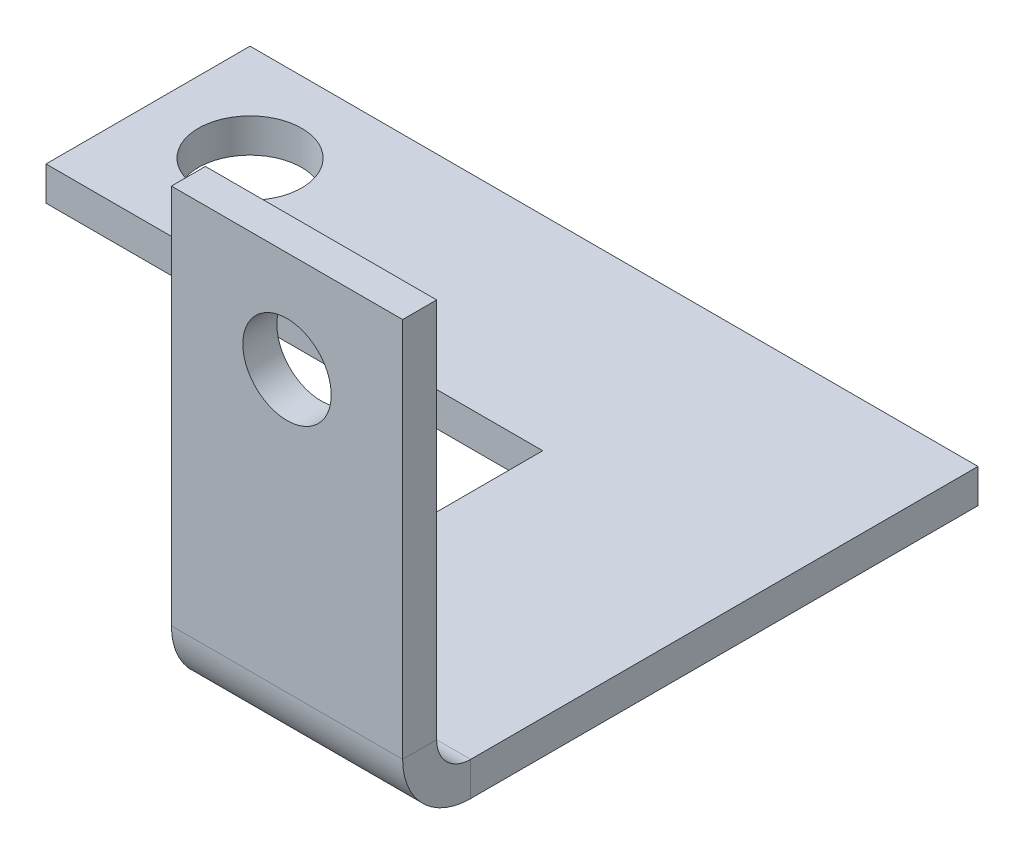
ISO-10303-21;
HEADER;
FILE_DESCRIPTION(('STEP AP214'),'2;1');
FILE_NAME('part.step','',(''),(''),'','','');
FILE_SCHEMA(('AUTOMOTIVE_DESIGN { 1 0 10303 214 1 1 1 1 }'));
ENDSEC;
DATA;
#1=APPLICATION_CONTEXT('core data for automotive mechanical design processes');
#2=APPLICATION_PROTOCOL_DEFINITION('international standard','automotive_design',2000,#1);
#3=PRODUCT_CONTEXT('',#1,'mechanical');
#4=PRODUCT('Part','Part','',(#3));
#5=PRODUCT_RELATED_PRODUCT_CATEGORY('part','',(#4));
#6=PRODUCT_DEFINITION_FORMATION('','',#4);
#7=PRODUCT_DEFINITION_CONTEXT('part definition',#1,'design');
#8=PRODUCT_DEFINITION('design','',#6,#7);
#9=PRODUCT_DEFINITION_SHAPE('','',#8);
#10=(LENGTH_UNIT() NAMED_UNIT(*) SI_UNIT(.MILLI.,.METRE.));
#11=(NAMED_UNIT(*) PLANE_ANGLE_UNIT() SI_UNIT($,.RADIAN.));
#12=(NAMED_UNIT(*) SI_UNIT($,.STERADIAN.) SOLID_ANGLE_UNIT());
#13=UNCERTAINTY_MEASURE_WITH_UNIT(LENGTH_MEASURE(1.E-05),#10,'distance_accuracy_value','');
#14=(GEOMETRIC_REPRESENTATION_CONTEXT(3) GLOBAL_UNCERTAINTY_ASSIGNED_CONTEXT((#13)) GLOBAL_UNIT_ASSIGNED_CONTEXT((#10,
#11,#12)) REPRESENTATION_CONTEXT('',''));
#15=CARTESIAN_POINT('',(0.,0.,0.));
#16=DIRECTION('',(0.,0.,1.));
#17=DIRECTION('',(1.,0.,0.));
#18=AXIS2_PLACEMENT_3D('',#15,#16,#17);
#19=CARTESIAN_POINT('',(0.,0.,3.175));
#20=DIRECTION('',(-1.,0.,0.));
#21=DIRECTION('',(0.,1.,0.));
#22=AXIS2_PLACEMENT_3D('',#19,#20,#21);
#23=PLANE('',#22);
#24=DIRECTION('',(0.,1.,0.));
#25=VECTOR('',#24,1.);
#26=CARTESIAN_POINT('',(0.,0.,0.));
#27=LINE('',#26,#25);
#28=CARTESIAN_POINT('',(0.,6.34999999999999,0.));
#29=VERTEX_POINT('',#28);
#30=CARTESIAN_POINT('',(0.,41.91,0.));
#31=VERTEX_POINT('',#30);
#32=EDGE_CURVE('E254',#29,#31,#27,.T.);
#33=ORIENTED_EDGE('',*,*,#32,.F.);
#34=DIRECTION('',(0.,0.,1.));
#35=VECTOR('',#34,1.);
#36=CARTESIAN_POINT('',(0.,6.34999999999999,0.));
#37=LINE('',#36,#35);
#38=CARTESIAN_POINT('',(0.,6.34999999999999,3.175));
#39=VERTEX_POINT('',#38);
#40=EDGE_CURVE('E226',#29,#39,#37,.T.);
#41=ORIENTED_EDGE('',*,*,#40,.T.);
#42=DIRECTION('',(0.,1.,0.));
#43=VECTOR('',#42,1.);
#44=CARTESIAN_POINT('',(0.,0.,3.175));
#45=LINE('',#44,#43);
#46=CARTESIAN_POINT('',(0.,41.91,3.175));
#47=VERTEX_POINT('',#46);
#48=EDGE_CURVE('E108',#39,#47,#45,.T.);
#49=ORIENTED_EDGE('',*,*,#48,.T.);
#50=DIRECTION('',(0.,0.,1.));
#51=VECTOR('',#50,1.);
#52=CARTESIAN_POINT('',(0.,41.91,3.175));
#53=LINE('',#52,#51);
#54=EDGE_CURVE('E92',#31,#47,#53,.T.);
#55=ORIENTED_EDGE('',*,*,#54,.F.);
#56=EDGE_LOOP('',(#33,#41,#49,#55));
#57=FACE_BOUND('',#56,.T.);
#58=ADVANCED_FACE('F84',(#57),#23,.T.);
#59=CARTESIAN_POINT('',(0.,0.,3.175));
#60=DIRECTION('',(0.,0.,-1.));
#61=DIRECTION('',(-1.,0.,0.));
#62=AXIS2_PLACEMENT_3D('',#59,#60,#61);
#63=PLANE('',#62);
#64=CARTESIAN_POINT('',(10.795,32.4752274840705,3.175));
#65=DIRECTION('',(0.,0.,-1.));
#66=DIRECTION('',(-1.,0.,0.));
#67=AXIS2_PLACEMENT_3D('',#64,#65,#66);
#68=CIRCLE('',#67,4.124999878);
#69=CARTESIAN_POINT('',(6.670000122,32.4752274840705,3.175));
#70=VERTEX_POINT('',#69);
#71=EDGE_CURVE('E242',#70,#70,#68,.T.);
#72=ORIENTED_EDGE('',*,*,#71,.T.);
#73=EDGE_LOOP('',(#72));
#74=FACE_BOUND('',#73,.T.);
#75=DIRECTION('',(-1.,0.,0.));
#76=VECTOR('',#75,1.);
#77=CARTESIAN_POINT('',(0.,6.34999999999999,3.175));
#78=LINE('',#77,#76);
#79=CARTESIAN_POINT('',(21.59,6.34999999999999,3.175));
#80=VERTEX_POINT('',#79);
#81=EDGE_CURVE('E126',#39,#80,#78,.F.);
#82=ORIENTED_EDGE('',*,*,#81,.T.);
#83=DIRECTION('',(0.,1.,0.));
#84=VECTOR('',#83,1.);
#85=CARTESIAN_POINT('',(21.59,0.,3.175));
#86=LINE('',#85,#84);
#87=CARTESIAN_POINT('',(21.59,41.91,3.175));
#88=VERTEX_POINT('',#87);
#89=EDGE_CURVE('E247',#80,#88,#86,.T.);
#90=ORIENTED_EDGE('',*,*,#89,.T.);
#91=DIRECTION('',(1.,0.,0.));
#92=VECTOR('',#91,1.);
#93=CARTESIAN_POINT('',(0.,41.91,3.175));
#94=LINE('',#93,#92);
#95=EDGE_CURVE('E249',#47,#88,#94,.T.);
#96=ORIENTED_EDGE('',*,*,#95,.F.);
#97=ORIENTED_EDGE('',*,*,#48,.F.);
#98=EDGE_LOOP('',(#82,#90,#96,#97));
#99=FACE_BOUND('',#98,.T.);
#100=ADVANCED_FACE('F262',(#74,#99),#63,.F.);
#101=CARTESIAN_POINT('',(0.,0.,0.));
#102=DIRECTION('',(0.,0.,-1.));
#103=DIRECTION('',(-1.,0.,0.));
#104=AXIS2_PLACEMENT_3D('',#101,#102,#103);
#105=PLANE('',#104);
#106=CARTESIAN_POINT('',(10.795,32.4752274840705,0.));
#107=DIRECTION('',(0.,0.,-1.));
#108=DIRECTION('',(-1.,0.,0.));
#109=AXIS2_PLACEMENT_3D('',#106,#107,#108);
#110=CIRCLE('',#109,4.124999878);
#111=CARTESIAN_POINT('',(6.670000122,32.4752274840705,0.));
#112=VERTEX_POINT('',#111);
#113=EDGE_CURVE('E240',#112,#112,#110,.T.);
#114=ORIENTED_EDGE('',*,*,#113,.F.);
#115=EDGE_LOOP('',(#114));
#116=FACE_BOUND('',#115,.T.);
#117=DIRECTION('',(0.,1.,0.));
#118=VECTOR('',#117,1.);
#119=CARTESIAN_POINT('',(21.59,0.,0.));
#120=LINE('',#119,#118);
#121=CARTESIAN_POINT('',(21.59,6.34999999999999,0.));
#122=VERTEX_POINT('',#121);
#123=CARTESIAN_POINT('',(21.59,41.91,0.));
#124=VERTEX_POINT('',#123);
#125=EDGE_CURVE('E120',#122,#124,#120,.T.);
#126=ORIENTED_EDGE('',*,*,#125,.F.);
#127=DIRECTION('',(-1.,0.,0.));
#128=VECTOR('',#127,1.);
#129=CARTESIAN_POINT('',(0.,6.34999999999999,0.));
#130=LINE('',#129,#128);
#131=EDGE_CURVE('E99',#29,#122,#130,.F.);
#132=ORIENTED_EDGE('',*,*,#131,.F.);
#133=ORIENTED_EDGE('',*,*,#32,.T.);
#134=DIRECTION('',(-1.,0.,0.));
#135=VECTOR('',#134,1.);
#136=CARTESIAN_POINT('',(0.,41.91,0.));
#137=LINE('',#136,#135);
#138=EDGE_CURVE('E245',#31,#124,#137,.F.);
#139=ORIENTED_EDGE('',*,*,#138,.T.);
#140=EDGE_LOOP('',(#126,#132,#133,#139));
#141=FACE_BOUND('',#140,.T.);
#142=ADVANCED_FACE('F263',(#116,#141),#105,.T.);
#143=CARTESIAN_POINT('',(21.59,0.,3.175));
#144=DIRECTION('',(-1.,0.,0.));
#145=DIRECTION('',(0.,1.,0.));
#146=AXIS2_PLACEMENT_3D('',#143,#144,#145);
#147=PLANE('',#146);
#148=DIRECTION('',(0.,0.,1.));
#149=VECTOR('',#148,1.);
#150=CARTESIAN_POINT('',(21.59,6.34999999999999,0.));
#151=LINE('',#150,#149);
#152=EDGE_CURVE('E237',#122,#80,#151,.T.);
#153=ORIENTED_EDGE('',*,*,#152,.F.);
#154=ORIENTED_EDGE('',*,*,#125,.T.);
#155=DIRECTION('',(0.,0.,1.));
#156=VECTOR('',#155,1.);
#157=CARTESIAN_POINT('',(21.59,41.91,3.175));
#158=LINE('',#157,#156);
#159=EDGE_CURVE('E13',#124,#88,#158,.T.);
#160=ORIENTED_EDGE('',*,*,#159,.T.);
#161=ORIENTED_EDGE('',*,*,#89,.F.);
#162=EDGE_LOOP('',(#153,#154,#160,#161));
#163=FACE_BOUND('',#162,.T.);
#164=ADVANCED_FACE('F86',(#163),#147,.F.);
#165=CARTESIAN_POINT('',(0.,41.91,3.175));
#166=DIRECTION('',(0.,1.,0.));
#167=DIRECTION('',(1.,0.,0.));
#168=AXIS2_PLACEMENT_3D('',#165,#166,#167);
#169=PLANE('',#168);
#170=ORIENTED_EDGE('',*,*,#159,.F.);
#171=ORIENTED_EDGE('',*,*,#138,.F.);
#172=ORIENTED_EDGE('',*,*,#54,.T.);
#173=ORIENTED_EDGE('',*,*,#95,.T.);
#174=EDGE_LOOP('',(#170,#171,#172,#173));
#175=FACE_BOUND('',#174,.T.);
#176=ADVANCED_FACE('F261',(#175),#169,.T.);
#177=CARTESIAN_POINT('',(10.795,32.4752274840705,3.175));
#178=DIRECTION('',(0.,0.,-1.));
#179=DIRECTION('',(-1.,0.,0.));
#180=AXIS2_PLACEMENT_3D('',#177,#178,#179);
#181=CYLINDRICAL_SURFACE('',#180,4.124999878);
#182=ORIENTED_EDGE('',*,*,#71,.F.);
#183=EDGE_LOOP('',(#182));
#184=FACE_BOUND('',#183,.T.);
#185=ORIENTED_EDGE('',*,*,#113,.T.);
#186=EDGE_LOOP('',(#185));
#187=FACE_BOUND('',#186,.T.);
#188=ADVANCED_FACE('F290',(#184,#187),#181,.F.);
#189=CARTESIAN_POINT('',(21.59,6.34999999999999,-3.175));
#190=DIRECTION('',(1.,0.,0.));
#191=DIRECTION('',(0.,1.,0.));
#192=AXIS2_PLACEMENT_3D('',#189,#190,#191);
#193=PLANE('',#192);
#194=DIRECTION('',(0.,1.,0.));
#195=VECTOR('',#194,1.);
#196=CARTESIAN_POINT('',(21.59,0.,-3.17499999999998));
#197=LINE('',#196,#195);
#198=CARTESIAN_POINT('',(21.59,3.17499999999999,-3.17499999999999));
#199=VERTEX_POINT('',#198);
#200=CARTESIAN_POINT('',(21.59,0.,-3.17499999999998));
#201=VERTEX_POINT('',#200);
#202=EDGE_CURVE('E193',#199,#201,#197,.F.);
#203=ORIENTED_EDGE('',*,*,#202,.F.);
#204=CARTESIAN_POINT('',(21.59,6.34999999999999,-3.175));
#205=DIRECTION('',(-1.,0.,0.));
#206=DIRECTION('',(0.,-1.,0.));
#207=AXIS2_PLACEMENT_3D('',#204,#205,#206);
#208=CIRCLE('',#207,3.175);
#209=EDGE_CURVE('E229',#122,#199,#208,.F.);
#210=ORIENTED_EDGE('',*,*,#209,.F.);
#211=ORIENTED_EDGE('',*,*,#152,.T.);
#212=CARTESIAN_POINT('',(21.59,6.34999999999999,-3.175));
#213=DIRECTION('',(-1.,0.,0.));
#214=DIRECTION('',(0.,-1.,0.));
#215=AXIS2_PLACEMENT_3D('',#212,#213,#214);
#216=CIRCLE('',#215,6.35);
#217=EDGE_CURVE('E222',#80,#201,#216,.F.);
#218=ORIENTED_EDGE('',*,*,#217,.T.);
#219=EDGE_LOOP('',(#203,#210,#211,#218));
#220=FACE_BOUND('',#219,.T.);
#221=ADVANCED_FACE('F288',(#220),#193,.T.);
#222=CARTESIAN_POINT('',(0.,6.34999999999999,-3.175));
#223=DIRECTION('',(1.,0.,0.));
#224=DIRECTION('',(0.,1.,0.));
#225=AXIS2_PLACEMENT_3D('',#222,#223,#224);
#226=PLANE('',#225);
#227=CARTESIAN_POINT('',(0.,6.34999999999999,-3.175));
#228=DIRECTION('',(-1.,0.,0.));
#229=DIRECTION('',(0.,-1.,0.));
#230=AXIS2_PLACEMENT_3D('',#227,#228,#229);
#231=CIRCLE('',#230,3.175);
#232=CARTESIAN_POINT('',(0.,3.17499999999999,-3.17499999999999));
#233=VERTEX_POINT('',#232);
#234=EDGE_CURVE('E233',#233,#29,#231,.T.);
#235=ORIENTED_EDGE('',*,*,#234,.F.);
#236=DIRECTION('',(0.,1.,0.));
#237=VECTOR('',#236,1.);
#238=CARTESIAN_POINT('',(0.,3.17499999999999,-3.17499999999999));
#239=LINE('',#238,#237);
#240=CARTESIAN_POINT('',(0.,0.,-3.17499999999998));
#241=VERTEX_POINT('',#240);
#242=EDGE_CURVE('E214',#233,#241,#239,.F.);
#243=ORIENTED_EDGE('',*,*,#242,.T.);
#244=CARTESIAN_POINT('',(0.,6.34999999999999,-3.175));
#245=DIRECTION('',(-1.,0.,0.));
#246=DIRECTION('',(0.,-1.,0.));
#247=AXIS2_PLACEMENT_3D('',#244,#245,#246);
#248=CIRCLE('',#247,6.35);
#249=EDGE_CURVE('E223',#241,#39,#248,.T.);
#250=ORIENTED_EDGE('',*,*,#249,.T.);
#251=ORIENTED_EDGE('',*,*,#40,.F.);
#252=EDGE_LOOP('',(#235,#243,#250,#251));
#253=FACE_BOUND('',#252,.T.);
#254=ADVANCED_FACE('F267',(#253),#226,.F.);
#255=CARTESIAN_POINT('',(0.,6.34999999999999,-3.175));
#256=DIRECTION('',(-1.,0.,0.));
#257=DIRECTION('',(0.,-1.,0.));
#258=AXIS2_PLACEMENT_3D('',#255,#256,#257);
#259=CYLINDRICAL_SURFACE('',#258,6.35);
#260=ORIENTED_EDGE('',*,*,#81,.F.);
#261=ORIENTED_EDGE('',*,*,#249,.F.);
#262=DIRECTION('',(-1.,0.,0.));
#263=VECTOR('',#262,1.);
#264=CARTESIAN_POINT('',(21.59,0.,-3.17499999999998));
#265=LINE('',#264,#263);
#266=EDGE_CURVE('E212',#241,#201,#265,.F.);
#267=ORIENTED_EDGE('',*,*,#266,.T.);
#268=ORIENTED_EDGE('',*,*,#217,.F.);
#269=EDGE_LOOP('',(#260,#261,#267,#268));
#270=FACE_BOUND('',#269,.T.);
#271=ADVANCED_FACE('F286',(#270),#259,.T.);
#272=CARTESIAN_POINT('',(0.,6.34999999999999,-3.175));
#273=DIRECTION('',(-1.,0.,0.));
#274=DIRECTION('',(0.,-1.,0.));
#275=AXIS2_PLACEMENT_3D('',#272,#273,#274);
#276=CYLINDRICAL_SURFACE('',#275,3.175);
#277=ORIENTED_EDGE('',*,*,#131,.T.);
#278=ORIENTED_EDGE('',*,*,#209,.T.);
#279=DIRECTION('',(-1.,0.,0.));
#280=VECTOR('',#279,1.);
#281=CARTESIAN_POINT('',(21.59,3.17499999999999,-3.17499999999999));
#282=LINE('',#281,#280);
#283=EDGE_CURVE('E217',#199,#233,#282,.T.);
#284=ORIENTED_EDGE('',*,*,#283,.T.);
#285=ORIENTED_EDGE('',*,*,#234,.T.);
#286=EDGE_LOOP('',(#277,#278,#284,#285));
#287=FACE_BOUND('',#286,.T.);
#288=ADVANCED_FACE('F270',(#287),#276,.F.);
#289=CARTESIAN_POINT('',(0.,-1.10154940724527E-13,-31.493260102));
#290=DIRECTION('',(1.,0.,0.));
#291=DIRECTION('',(0.,0.,-1.));
#292=AXIS2_PLACEMENT_3D('',#289,#290,#291);
#293=PLANE('',#292);
#294=ORIENTED_EDGE('',*,*,#242,.F.);
#295=DIRECTION('',(0.,0.,1.));
#296=VECTOR('',#295,1.);
#297=CARTESIAN_POINT('',(0.,3.17499999999989,-31.493260102));
#298=LINE('',#297,#296);
#299=CARTESIAN_POINT('',(0.,3.17499999999989,-31.493260102));
#300=VERTEX_POINT('',#299);
#301=EDGE_CURVE('E210',#233,#300,#298,.F.);
#302=ORIENTED_EDGE('',*,*,#301,.T.);
#303=DIRECTION('',(0.,-1.,0.));
#304=VECTOR('',#303,1.);
#305=CARTESIAN_POINT('',(0.,-1.10154940724527E-13,-31.493260102));
#306=LINE('',#305,#304);
#307=CARTESIAN_POINT('',(0.,-1.09958129945466E-13,-31.493260102));
#308=VERTEX_POINT('',#307);
#309=EDGE_CURVE('E236',#308,#300,#306,.F.);
#310=ORIENTED_EDGE('',*,*,#309,.F.);
#311=DIRECTION('',(0.,0.,-1.));
#312=VECTOR('',#311,1.);
#313=CARTESIAN_POINT('',(0.,0.,0.));
#314=LINE('',#313,#312);
#315=EDGE_CURVE('E200',#241,#308,#314,.T.);
#316=ORIENTED_EDGE('',*,*,#315,.F.);
#317=EDGE_LOOP('',(#294,#302,#310,#316));
#318=FACE_BOUND('',#317,.T.);
#319=ADVANCED_FACE('F281',(#318),#293,.F.);
#320=CARTESIAN_POINT('',(21.59,0.,0.));
#321=DIRECTION('',(-1.,0.,0.));
#322=DIRECTION('',(0.,0.,1.));
#323=AXIS2_PLACEMENT_3D('',#320,#321,#322);
#324=PLANE('',#323);
#325=ORIENTED_EDGE('',*,*,#202,.T.);
#326=DIRECTION('',(0.,0.,1.));
#327=VECTOR('',#326,1.);
#328=CARTESIAN_POINT('',(21.59,0.,0.));
#329=LINE('',#328,#327);
#330=CARTESIAN_POINT('',(21.59,-1.76470849450428E-13,-50.543260102));
#331=VERTEX_POINT('',#330);
#332=EDGE_CURVE('E175',#331,#201,#329,.T.);
#333=ORIENTED_EDGE('',*,*,#332,.F.);
#334=DIRECTION('',(0.,1.,0.));
#335=VECTOR('',#334,1.);
#336=CARTESIAN_POINT('',(21.59,-1.76470849450428E-13,-50.543260102));
#337=LINE('',#336,#335);
#338=CARTESIAN_POINT('',(21.59,3.17499999999982,-50.543260102));
#339=VERTEX_POINT('',#338);
#340=EDGE_CURVE('E183',#331,#339,#337,.T.);
#341=ORIENTED_EDGE('',*,*,#340,.T.);
#342=DIRECTION('',(0.,0.,-1.));
#343=VECTOR('',#342,1.);
#344=CARTESIAN_POINT('',(21.59,3.175,0.));
#345=LINE('',#344,#343);
#346=EDGE_CURVE('E202',#339,#199,#345,.F.);
#347=ORIENTED_EDGE('',*,*,#346,.T.);
#348=EDGE_LOOP('',(#325,#333,#341,#347));
#349=FACE_BOUND('',#348,.T.);
#350=ADVANCED_FACE('F192',(#349),#324,.F.);
#351=CARTESIAN_POINT('',(0.,0.,0.));
#352=DIRECTION('',(0.,1.,0.));
#353=DIRECTION('',(0.,0.,1.));
#354=AXIS2_PLACEMENT_3D('',#351,#352,#353);
#355=PLANE('',#354);
#356=CARTESIAN_POINT('',(-37.3266251276885,-3.32633226518553E-13,-41.493240102));
#357=DIRECTION('',(0.,1.,0.));
#358=DIRECTION('',(0.,0.,1.));
#359=AXIS2_PLACEMENT_3D('',#356,#357,#358);
#360=CIRCLE('',#359,4.826);
#361=CARTESIAN_POINT('',(-37.3266251276885,-3.15783337579553E-13,-36.667240102));
#362=VERTEX_POINT('',#361);
#363=EDGE_CURVE('E220',#362,#362,#360,.T.);
#364=ORIENTED_EDGE('',*,*,#363,.T.);
#365=EDGE_LOOP('',(#364));
#366=FACE_BOUND('',#365,.T.);
#367=ORIENTED_EDGE('',*,*,#266,.F.);
#368=ORIENTED_EDGE('',*,*,#315,.T.);
#369=DIRECTION('',(-1.,0.,0.));
#370=VECTOR('',#369,1.);
#371=CARTESIAN_POINT('',(0.,-1.09958129945466E-13,-31.493260102));
#372=LINE('',#371,#370);
#373=CARTESIAN_POINT('',(-46.3766451276885,-1.09958129945466E-13,-31.493260102));
#374=VERTEX_POINT('',#373);
#375=EDGE_CURVE('E198',#308,#374,#372,.T.);
#376=ORIENTED_EDGE('',*,*,#375,.T.);
#377=DIRECTION('',(0.,0.,-1.));
#378=VECTOR('',#377,1.);
#379=CARTESIAN_POINT('',(-46.3766451276885,0.,0.));
#380=LINE('',#379,#378);
#381=CARTESIAN_POINT('',(-46.3766451276885,-1.76470849450428E-13,-50.543260102));
#382=VERTEX_POINT('',#381);
#383=EDGE_CURVE('E177',#374,#382,#380,.T.);
#384=ORIENTED_EDGE('',*,*,#383,.T.);
#385=DIRECTION('',(1.,0.,0.));
#386=VECTOR('',#385,1.);
#387=CARTESIAN_POINT('',(0.,-1.76470849450428E-13,-50.543260102));
#388=LINE('',#387,#386);
#389=EDGE_CURVE('E170',#382,#331,#388,.T.);
#390=ORIENTED_EDGE('',*,*,#389,.T.);
#391=ORIENTED_EDGE('',*,*,#332,.T.);
#392=EDGE_LOOP('',(#367,#368,#376,#384,#390,#391));
#393=FACE_BOUND('',#392,.T.);
#394=ADVANCED_FACE('F173',(#366,#393),#355,.F.);
#395=CARTESIAN_POINT('',(0.,3.175,0.));
#396=DIRECTION('',(0.,1.,0.));
#397=DIRECTION('',(0.,0.,1.));
#398=AXIS2_PLACEMENT_3D('',#395,#396,#397);
#399=PLANE('',#398);
#400=CARTESIAN_POINT('',(-37.3266251276885,3.17499999999986,-41.493240102));
#401=DIRECTION('',(0.,1.,0.));
#402=DIRECTION('',(0.,0.,1.));
#403=AXIS2_PLACEMENT_3D('',#400,#401,#402);
#404=CIRCLE('',#403,4.826);
#405=CARTESIAN_POINT('',(-37.3266251276885,3.17499999999987,-36.667240102));
#406=VERTEX_POINT('',#405);
#407=EDGE_CURVE('E491',#406,#406,#404,.T.);
#408=ORIENTED_EDGE('',*,*,#407,.F.);
#409=EDGE_LOOP('',(#408));
#410=FACE_BOUND('',#409,.T.);
#411=ORIENTED_EDGE('',*,*,#301,.F.);
#412=ORIENTED_EDGE('',*,*,#283,.F.);
#413=ORIENTED_EDGE('',*,*,#346,.F.);
#414=DIRECTION('',(-1.,0.,0.));
#415=VECTOR('',#414,1.);
#416=CARTESIAN_POINT('',(21.59,3.17499999999982,-50.543260102));
#417=LINE('',#416,#415);
#418=CARTESIAN_POINT('',(-46.3766451276885,3.17499999999982,-50.543260102));
#419=VERTEX_POINT('',#418);
#420=EDGE_CURVE('E185',#419,#339,#417,.F.);
#421=ORIENTED_EDGE('',*,*,#420,.F.);
#422=DIRECTION('',(0.,0.,1.));
#423=VECTOR('',#422,1.);
#424=CARTESIAN_POINT('',(-46.3766451276885,3.17499999999982,-50.543260102));
#425=LINE('',#424,#423);
#426=CARTESIAN_POINT('',(-46.3766451276885,3.17499999999989,-31.493260102));
#427=VERTEX_POINT('',#426);
#428=EDGE_CURVE('E205',#427,#419,#425,.F.);
#429=ORIENTED_EDGE('',*,*,#428,.F.);
#430=DIRECTION('',(1.,0.,0.));
#431=VECTOR('',#430,1.);
#432=CARTESIAN_POINT('',(-46.3766451276885,3.17499999999989,-31.493260102));
#433=LINE('',#432,#431);
#434=EDGE_CURVE('E208',#300,#427,#433,.F.);
#435=ORIENTED_EDGE('',*,*,#434,.F.);
#436=EDGE_LOOP('',(#411,#412,#413,#421,#429,#435));
#437=FACE_BOUND('',#436,.T.);
#438=ADVANCED_FACE('F275',(#410,#437),#399,.T.);
#439=CARTESIAN_POINT('',(-46.3766451276885,-1.10154940724527E-13,-31.493260102));
#440=DIRECTION('',(0.,0.,-1.));
#441=DIRECTION('',(0.,1.,0.));
#442=AXIS2_PLACEMENT_3D('',#439,#440,#441);
#443=PLANE('',#442);
#444=ORIENTED_EDGE('',*,*,#434,.T.);
#445=DIRECTION('',(0.,1.,0.));
#446=VECTOR('',#445,1.);
#447=CARTESIAN_POINT('',(-46.3766451276885,-1.09995394175678E-13,-31.493260102));
#448=LINE('',#447,#446);
#449=EDGE_CURVE('E496',#374,#427,#448,.T.);
#450=ORIENTED_EDGE('',*,*,#449,.F.);
#451=ORIENTED_EDGE('',*,*,#375,.F.);
#452=ORIENTED_EDGE('',*,*,#309,.T.);
#453=EDGE_LOOP('',(#444,#450,#451,#452));
#454=FACE_BOUND('',#453,.T.);
#455=ADVANCED_FACE('F406',(#454),#443,.F.);
#456=CARTESIAN_POINT('',(-46.3766451276885,-1.7650811368064E-13,-50.543260102));
#457=DIRECTION('',(1.,0.,0.));
#458=DIRECTION('',(0.,0.,-1.));
#459=AXIS2_PLACEMENT_3D('',#456,#457,#458);
#460=PLANE('',#459);
#461=ORIENTED_EDGE('',*,*,#428,.T.);
#462=DIRECTION('',(0.,1.,0.));
#463=VECTOR('',#462,1.);
#464=CARTESIAN_POINT('',(-46.3766451276885,-1.7650811368064E-13,-50.543260102));
#465=LINE('',#464,#463);
#466=EDGE_CURVE('E189',#382,#419,#465,.T.);
#467=ORIENTED_EDGE('',*,*,#466,.F.);
#468=ORIENTED_EDGE('',*,*,#383,.F.);
#469=ORIENTED_EDGE('',*,*,#449,.T.);
#470=EDGE_LOOP('',(#461,#467,#468,#469));
#471=FACE_BOUND('',#470,.T.);
#472=ADVANCED_FACE('F411',(#471),#460,.F.);
#473=CARTESIAN_POINT('',(21.59,-1.7650811368064E-13,-50.543260102));
#474=DIRECTION('',(0.,0.,1.));
#475=DIRECTION('',(0.,-1.,0.));
#476=AXIS2_PLACEMENT_3D('',#473,#474,#475);
#477=PLANE('',#476);
#478=ORIENTED_EDGE('',*,*,#420,.T.);
#479=ORIENTED_EDGE('',*,*,#340,.F.);
#480=ORIENTED_EDGE('',*,*,#389,.F.);
#481=ORIENTED_EDGE('',*,*,#466,.T.);
#482=EDGE_LOOP('',(#478,#479,#480,#481));
#483=FACE_BOUND('',#482,.T.);
#484=ADVANCED_FACE('F184',(#483),#477,.F.);
#485=CARTESIAN_POINT('',(-37.3266251276885,-3.32633226518553E-13,-41.493240102));
#486=DIRECTION('',(0.,1.,0.));
#487=DIRECTION('',(0.,0.,1.));
#488=AXIS2_PLACEMENT_3D('',#485,#486,#487);
#489=CYLINDRICAL_SURFACE('',#488,4.826);
#490=CARTESIAN_POINT('',(-37.3266251276885,-3.15783337579553E-13,-36.667240102));
#491=CARTESIAN_POINT('',(-37.3266251276885,0.0330729166663529,-36.667240102));
#492=CARTESIAN_POINT('',(-37.3266251276885,0.0661458333330215,-36.667240102));
#493=CARTESIAN_POINT('',(-37.3266251276885,0.132291666666359,-36.667240102));
#494=CARTESIAN_POINT('',(-37.3266251276885,0.165364583333027,-36.667240102));
#495=CARTESIAN_POINT('',(-37.3266251276885,0.231510416666365,-36.667240102));
#496=CARTESIAN_POINT('',(-37.3266251276885,0.264583333333033,-36.667240102));
#497=CARTESIAN_POINT('',(-37.3266251276885,0.33072916666637,-36.667240102));
#498=CARTESIAN_POINT('',(-37.3266251276885,0.363802083333039,-36.667240102));
#499=CARTESIAN_POINT('',(-37.3266251276885,0.429947916666376,-36.667240102));
#500=CARTESIAN_POINT('',(-37.3266251276885,0.463020833333045,-36.667240102));
#501=CARTESIAN_POINT('',(-37.3266251276885,0.529166666666382,-36.667240102));
#502=CARTESIAN_POINT('',(-37.3266251276885,0.562239583333051,-36.667240102));
#503=CARTESIAN_POINT('',(-37.3266251276885,0.628385416666388,-36.667240102));
#504=CARTESIAN_POINT('',(-37.3266251276885,0.661458333333057,-36.667240102));
#505=CARTESIAN_POINT('',(-37.3266251276885,0.727604166666394,-36.667240102));
#506=CARTESIAN_POINT('',(-37.3266251276885,0.760677083333062,-36.667240102));
#507=CARTESIAN_POINT('',(-37.3266251276885,0.8268229166664,-36.667240102));
#508=CARTESIAN_POINT('',(-37.3266251276885,0.859895833333068,-36.667240102));
#509=CARTESIAN_POINT('',(-37.3266251276885,0.926041666666406,-36.667240102));
#510=CARTESIAN_POINT('',(-37.3266251276885,0.959114583333074,-36.667240102));
#511=CARTESIAN_POINT('',(-37.3266251276885,1.02526041666641,-36.667240102));
#512=CARTESIAN_POINT('',(-37.3266251276885,1.05833333333308,-36.667240102));
#513=CARTESIAN_POINT('',(-37.3266251276885,1.12447916666642,-36.667240102));
#514=CARTESIAN_POINT('',(-37.3266251276885,1.15755208333309,-36.667240102));
#515=CARTESIAN_POINT('',(-37.3266251276885,1.22369791666642,-36.667240102));
#516=CARTESIAN_POINT('',(-37.3266251276885,1.25677083333309,-36.667240102));
#517=CARTESIAN_POINT('',(-37.3266251276885,1.32291666666643,-36.667240102));
#518=CARTESIAN_POINT('',(-37.3266251276885,1.3559895833331,-36.667240102));
#519=CARTESIAN_POINT('',(-37.3266251276885,1.42213541666644,-36.667240102));
#520=CARTESIAN_POINT('',(-37.3266251276885,1.4552083333331,-36.667240102));
#521=CARTESIAN_POINT('',(-37.3266251276885,1.52135416666644,-36.667240102));
#522=CARTESIAN_POINT('',(-37.3266251276885,1.55442708333311,-36.667240102));
#523=CARTESIAN_POINT('',(-37.3266251276885,1.62057291666645,-36.667240102));
#524=CARTESIAN_POINT('',(-37.3266251276885,1.65364583333312,-36.667240102));
#525=CARTESIAN_POINT('',(-37.3266251276885,1.71979166666645,-36.667240102));
#526=CARTESIAN_POINT('',(-37.3266251276885,1.75286458333312,-36.667240102));
#527=CARTESIAN_POINT('',(-37.3266251276885,1.81901041666646,-36.667240102));
#528=CARTESIAN_POINT('',(-37.3266251276885,1.85208333333313,-36.667240102));
#529=CARTESIAN_POINT('',(-37.3266251276885,1.91822916666646,-36.667240102));
#530=CARTESIAN_POINT('',(-37.3266251276885,1.95130208333313,-36.667240102));
#531=CARTESIAN_POINT('',(-37.3266251276885,2.01744791666647,-36.667240102));
#532=CARTESIAN_POINT('',(-37.3266251276885,2.05052083333314,-36.667240102));
#533=CARTESIAN_POINT('',(-37.3266251276885,2.11666666666648,-36.667240102));
#534=CARTESIAN_POINT('',(-37.3266251276885,2.14973958333314,-36.667240102));
#535=CARTESIAN_POINT('',(-37.3266251276885,2.21588541666648,-36.667240102));
#536=CARTESIAN_POINT('',(-37.3266251276885,2.24895833333315,-36.667240102));
#537=CARTESIAN_POINT('',(-37.3266251276885,2.31510416666649,-36.667240102));
#538=CARTESIAN_POINT('',(-37.3266251276885,2.34817708333316,-36.667240102));
#539=CARTESIAN_POINT('',(-37.3266251276885,2.41432291666649,-36.667240102));
#540=CARTESIAN_POINT('',(-37.3266251276885,2.44739583333316,-36.667240102));
#541=CARTESIAN_POINT('',(-37.3266251276885,2.5135416666665,-36.667240102));
#542=CARTESIAN_POINT('',(-37.3266251276885,2.54661458333317,-36.667240102));
#543=CARTESIAN_POINT('',(-37.3266251276885,2.61276041666651,-36.667240102));
#544=CARTESIAN_POINT('',(-37.3266251276885,2.64583333333317,-36.667240102));
#545=CARTESIAN_POINT('',(-37.3266251276885,2.71197916666651,-36.667240102));
#546=CARTESIAN_POINT('',(-37.3266251276885,2.74505208333318,-36.667240102));
#547=CARTESIAN_POINT('',(-37.3266251276885,2.81119791666652,-36.667240102));
#548=CARTESIAN_POINT('',(-37.3266251276885,2.84427083333319,-36.667240102));
#549=CARTESIAN_POINT('',(-37.3266251276885,2.91041666666652,-36.667240102));
#550=CARTESIAN_POINT('',(-37.3266251276885,2.94348958333319,-36.667240102));
#551=CARTESIAN_POINT('',(-37.3266251276885,3.00963541666653,-36.667240102));
#552=CARTESIAN_POINT('',(-37.3266251276885,3.0427083333332,-36.667240102));
#553=CARTESIAN_POINT('',(-37.3266251276885,3.10885416666653,-36.667240102));
#554=CARTESIAN_POINT('',(-37.3266251276885,3.1419270833332,-36.667240102));
#555=CARTESIAN_POINT('',(-37.3266251276885,3.17499999999987,-36.667240102));
#556=B_SPLINE_CURVE_WITH_KNOTS('',3,(#490,#491,#492,#493,#494,#495,#496,#497,#498,#499,#500,
#501,#502,#503,#504,#505,#506,#507,#508,#509,#510,#511,#512,#513,#514,#515,#516,#517,#518,#519,
#520,#521,#522,#523,#524,#525,#526,#527,#528,#529,#530,#531,#532,#533,#534,#535,#536,#537,#538,
#539,#540,#541,#542,#543,#544,#545,#546,#547,#548,#549,#550,#551,#552,#553,#554,#555),
.UNSPECIFIED.,.F.,.F.,(4,2,2,2,2,2,2,2,2,2,2,2,2,2,2,2,2,2,2,2,2,2,2,2,2,2,2,2,2,2,2,2,4),(0.,
0.0992187500000059,0.198437500000012,0.297656250000018,0.396875000000024,0.496093750000029,
0.595312500000035,0.694531250000041,0.793750000000047,0.892968750000053,0.992187500000059,
1.09140625000006,1.19062500000007,1.28984375000008,1.38906250000008,1.48828125000009,
1.58750000000009,1.6867187500001,1.78593750000011,1.88515625000011,1.98437500000012,
2.08359375000012,2.18281250000013,2.28203125000013,2.38125000000014,2.48046875000015,
2.57968750000015,2.67890625000016,2.77812500000016,2.87734375000017,2.97656250000018,
3.07578125000018,3.17500000000019),.UNSPECIFIED.);
#557=EDGE_CURVE('BSEAM434',#362,#406,#556,.T.);
#558=ORIENTED_EDGE('',*,*,#363,.F.);
#559=ORIENTED_EDGE('',*,*,#407,.T.);
#560=ORIENTED_EDGE('',*,*,#557,.T.);
#561=ORIENTED_EDGE('',*,*,#557,.F.);
#562=EDGE_LOOP('',(#558,#560,#559,#561));
#563=FACE_BOUND('',#562,.T.);
#564=ADVANCED_FACE('F434',(#563),#489,.F.);
#565=CLOSED_SHELL('',(#58,#100,#142,#164,#176,#188,#221,#254,#271,#288,#319,#350,#394,#438,#455,
#472,#484,#564));
#566=MANIFOLD_SOLID_BREP('B2',#565);
#567=ADVANCED_BREP_SHAPE_REPRESENTATION('',(#18,#566),#14);
#568=SHAPE_DEFINITION_REPRESENTATION(#9,#567);
ENDSEC;
END-ISO-10303-21;
